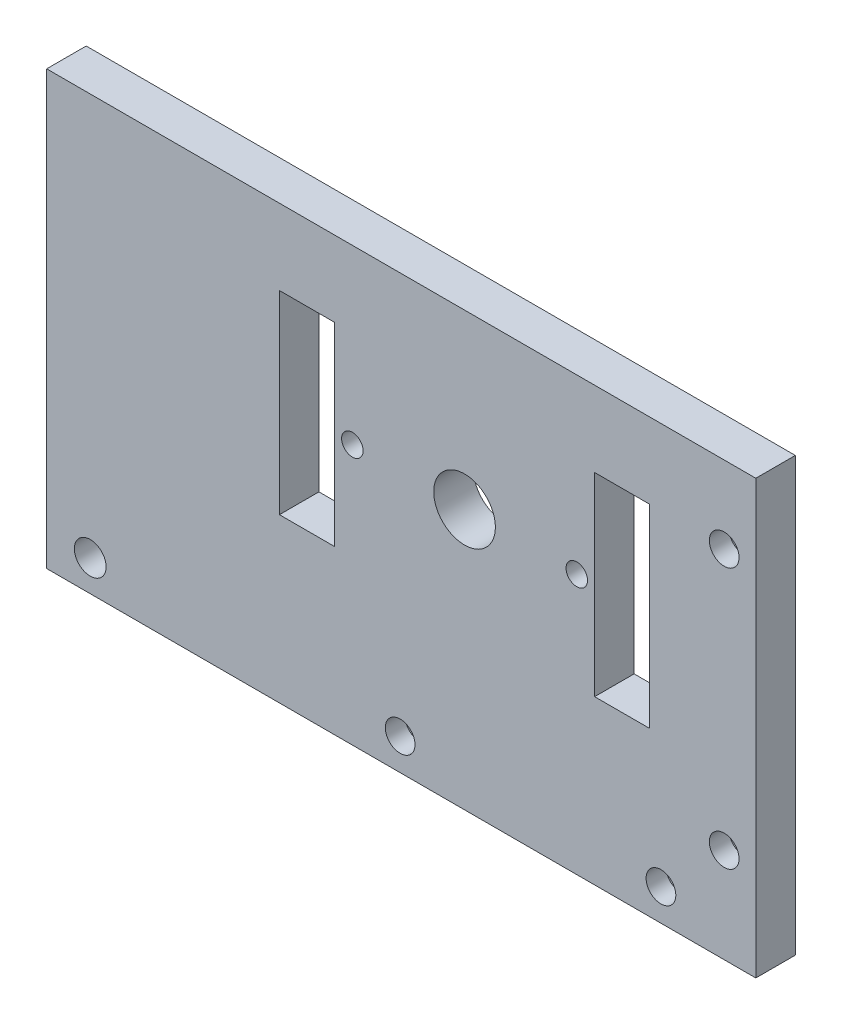
ISO-10303-21;
HEADER;
FILE_DESCRIPTION(('STEP AP214'),'2;1');
FILE_NAME('part.step','',(''),(''),'','','');
FILE_SCHEMA(('AUTOMOTIVE_DESIGN { 1 0 10303 214 1 1 1 1 }'));
ENDSEC;
DATA;
#1=APPLICATION_CONTEXT('core data for automotive mechanical design processes');
#2=APPLICATION_PROTOCOL_DEFINITION('international standard','automotive_design',2000,#1);
#3=PRODUCT_CONTEXT('',#1,'mechanical');
#4=PRODUCT('Part','Part','',(#3));
#5=PRODUCT_RELATED_PRODUCT_CATEGORY('part','',(#4));
#6=PRODUCT_DEFINITION_FORMATION('','',#4);
#7=PRODUCT_DEFINITION_CONTEXT('part definition',#1,'design');
#8=PRODUCT_DEFINITION('design','',#6,#7);
#9=PRODUCT_DEFINITION_SHAPE('','',#8);
#10=(LENGTH_UNIT() NAMED_UNIT(*) SI_UNIT(.MILLI.,.METRE.));
#11=(NAMED_UNIT(*) PLANE_ANGLE_UNIT() SI_UNIT($,.RADIAN.));
#12=(NAMED_UNIT(*) SI_UNIT($,.STERADIAN.) SOLID_ANGLE_UNIT());
#13=UNCERTAINTY_MEASURE_WITH_UNIT(LENGTH_MEASURE(1.E-05),#10,'distance_accuracy_value','');
#14=(GEOMETRIC_REPRESENTATION_CONTEXT(3) GLOBAL_UNCERTAINTY_ASSIGNED_CONTEXT((#13)) GLOBAL_UNIT_ASSIGNED_CONTEXT((#10,
#11,#12)) REPRESENTATION_CONTEXT('',''));
#15=CARTESIAN_POINT('',(0.,0.,0.));
#16=DIRECTION('',(0.,0.,1.));
#17=DIRECTION('',(1.,0.,0.));
#18=AXIS2_PLACEMENT_3D('',#15,#16,#17);
#19=CARTESIAN_POINT('',(-7.87400000000002,59.944,6.35));
#20=DIRECTION('',(0.,0.,-1.));
#21=DIRECTION('',(-1.,0.,0.));
#22=AXIS2_PLACEMENT_3D('',#19,#20,#21);
#23=CYLINDRICAL_SURFACE('',#22,1.5875);
#24=CARTESIAN_POINT('',(-7.87400000000002,59.944,0.));
#25=DIRECTION('',(0.,0.,1.));
#26=DIRECTION('',(1.,0.,0.));
#27=AXIS2_PLACEMENT_3D('',#24,#25,#26);
#28=CIRCLE('',#27,1.5875);
#29=CARTESIAN_POINT('',(-6.28650000000002,59.944,0.));
#30=VERTEX_POINT('',#29);
#31=EDGE_CURVE('E242',#30,#30,#28,.T.);
#32=ORIENTED_EDGE('',*,*,#31,.F.);
#33=EDGE_LOOP('',(#32));
#34=FACE_BOUND('',#33,.T.);
#35=CARTESIAN_POINT('',(-7.87400000000002,59.944,3.175));
#36=DIRECTION('',(0.,0.,1.));
#37=DIRECTION('',(1.,0.,0.));
#38=AXIS2_PLACEMENT_3D('',#35,#36,#37);
#39=CIRCLE('',#38,1.5875);
#40=CARTESIAN_POINT('',(-6.28650000000002,59.944,3.175));
#41=VERTEX_POINT('',#40);
#42=EDGE_CURVE('E307',#41,#41,#39,.T.);
#43=ORIENTED_EDGE('',*,*,#42,.T.);
#44=EDGE_LOOP('',(#43));
#45=FACE_BOUND('',#44,.T.);
#46=ADVANCED_FACE('F73',(#34,#45),#23,.F.);
#47=CARTESIAN_POINT('',(-18.034,7.87400000000001,6.35));
#48=DIRECTION('',(0.,0.,-1.));
#49=DIRECTION('',(-1.,0.,0.));
#50=AXIS2_PLACEMENT_3D('',#47,#48,#49);
#51=CYLINDRICAL_SURFACE('',#50,1.5875);
#52=CARTESIAN_POINT('',(-18.034,7.87400000000001,0.));
#53=DIRECTION('',(0.,0.,1.));
#54=DIRECTION('',(1.,0.,0.));
#55=AXIS2_PLACEMENT_3D('',#52,#53,#54);
#56=CIRCLE('',#55,1.5875);
#57=CARTESIAN_POINT('',(-16.4465,7.87400000000001,0.));
#58=VERTEX_POINT('',#57);
#59=EDGE_CURVE('E238',#58,#58,#56,.T.);
#60=ORIENTED_EDGE('',*,*,#59,.F.);
#61=EDGE_LOOP('',(#60));
#62=FACE_BOUND('',#61,.T.);
#63=CARTESIAN_POINT('',(-18.034,7.87400000000001,3.175));
#64=DIRECTION('',(0.,0.,1.));
#65=DIRECTION('',(1.,0.,0.));
#66=AXIS2_PLACEMENT_3D('',#63,#64,#65);
#67=CIRCLE('',#66,1.5875);
#68=CARTESIAN_POINT('',(-16.4465,7.87400000000001,3.175));
#69=VERTEX_POINT('',#68);
#70=EDGE_CURVE('E318',#69,#69,#67,.T.);
#71=ORIENTED_EDGE('',*,*,#70,.T.);
#72=EDGE_LOOP('',(#71));
#73=FACE_BOUND('',#72,.T.);
#74=ADVANCED_FACE('F423',(#62,#73),#51,.F.);
#75=CARTESIAN_POINT('',(-59.944,7.87400000000001,6.35));
#76=DIRECTION('',(0.,0.,-1.));
#77=DIRECTION('',(-1.,0.,0.));
#78=AXIS2_PLACEMENT_3D('',#75,#76,#77);
#79=CYLINDRICAL_SURFACE('',#78,1.5875);
#80=CARTESIAN_POINT('',(-59.944,7.87400000000001,0.));
#81=DIRECTION('',(0.,0.,1.));
#82=DIRECTION('',(1.,0.,0.));
#83=AXIS2_PLACEMENT_3D('',#80,#81,#82);
#84=CIRCLE('',#83,1.5875);
#85=CARTESIAN_POINT('',(-58.3565,7.87400000000001,0.));
#86=VERTEX_POINT('',#85);
#87=EDGE_CURVE('E234',#86,#86,#84,.T.);
#88=ORIENTED_EDGE('',*,*,#87,.F.);
#89=EDGE_LOOP('',(#88));
#90=FACE_BOUND('',#89,.T.);
#91=CARTESIAN_POINT('',(-59.944,7.87400000000001,3.175));
#92=DIRECTION('',(0.,0.,1.));
#93=DIRECTION('',(1.,0.,0.));
#94=AXIS2_PLACEMENT_3D('',#91,#92,#93);
#95=CIRCLE('',#94,1.5875);
#96=CARTESIAN_POINT('',(-58.3565,7.87400000000001,3.175));
#97=VERTEX_POINT('',#96);
#98=EDGE_CURVE('E322',#97,#97,#95,.T.);
#99=ORIENTED_EDGE('',*,*,#98,.T.);
#100=EDGE_LOOP('',(#99));
#101=FACE_BOUND('',#100,.T.);
#102=ADVANCED_FACE('F429',(#90,#101),#79,.F.);
#103=CARTESIAN_POINT('',(-7.87399999999999,18.034,6.35));
#104=DIRECTION('',(0.,0.,-1.));
#105=DIRECTION('',(-1.,0.,0.));
#106=AXIS2_PLACEMENT_3D('',#103,#104,#105);
#107=CYLINDRICAL_SURFACE('',#106,1.5875);
#108=CARTESIAN_POINT('',(-7.87399999999999,18.034,0.));
#109=DIRECTION('',(0.,0.,1.));
#110=DIRECTION('',(1.,0.,0.));
#111=AXIS2_PLACEMENT_3D('',#108,#109,#110);
#112=CIRCLE('',#111,1.5875);
#113=CARTESIAN_POINT('',(-6.28649999999999,18.034,0.));
#114=VERTEX_POINT('',#113);
#115=EDGE_CURVE('E246',#114,#114,#112,.T.);
#116=ORIENTED_EDGE('',*,*,#115,.F.);
#117=EDGE_LOOP('',(#116));
#118=FACE_BOUND('',#117,.T.);
#119=CARTESIAN_POINT('',(-7.87399999999999,18.034,3.175));
#120=DIRECTION('',(0.,0.,1.));
#121=DIRECTION('',(1.,0.,0.));
#122=AXIS2_PLACEMENT_3D('',#119,#120,#121);
#123=CIRCLE('',#122,1.5875);
#124=CARTESIAN_POINT('',(-6.28649999999999,18.034,3.175));
#125=VERTEX_POINT('',#124);
#126=EDGE_CURVE('E308',#125,#125,#123,.T.);
#127=ORIENTED_EDGE('',*,*,#126,.T.);
#128=EDGE_LOOP('',(#127));
#129=FACE_BOUND('',#128,.T.);
#130=ADVANCED_FACE('F435',(#118,#129),#107,.F.);
#131=CARTESIAN_POINT('',(0.,60.1939999998697,6.35));
#132=DIRECTION('',(0.,1.,0.));
#133=DIRECTION('',(-1.,0.,0.));
#134=AXIS2_PLACEMENT_3D('',#131,#132,#133);
#135=PLANE('',#134);
#136=DIRECTION('',(1.,0.,0.));
#137=VECTOR('',#136,1.);
#138=CARTESIAN_POINT('',(0.,60.1939999998697,0.));
#139=LINE('',#138,#137);
#140=CARTESIAN_POINT('',(-28.6940000001301,60.1939999998697,0.));
#141=VERTEX_POINT('',#140);
#142=CARTESIAN_POINT('',(-19.8440000001301,60.1939999998697,0.));
#143=VERTEX_POINT('',#142);
#144=EDGE_CURVE('E222',#141,#143,#139,.T.);
#145=ORIENTED_EDGE('',*,*,#144,.T.);
#146=DIRECTION('',(0.,0.,-1.));
#147=VECTOR('',#146,1.);
#148=CARTESIAN_POINT('',(-19.8440000001301,60.1939999998697,6.35));
#149=LINE('',#148,#147);
#150=CARTESIAN_POINT('',(-19.8440000001301,60.1939999998697,6.35));
#151=VERTEX_POINT('',#150);
#152=EDGE_CURVE('E12',#151,#143,#149,.T.);
#153=ORIENTED_EDGE('',*,*,#152,.F.);
#154=DIRECTION('',(1.,0.,0.));
#155=VECTOR('',#154,1.);
#156=CARTESIAN_POINT('',(0.,60.1939999998697,6.35));
#157=LINE('',#156,#155);
#158=CARTESIAN_POINT('',(-28.6940000001301,60.1939999998697,6.35));
#159=VERTEX_POINT('',#158);
#160=EDGE_CURVE('E168',#159,#151,#157,.T.);
#161=ORIENTED_EDGE('',*,*,#160,.F.);
#162=DIRECTION('',(0.,0.,-1.));
#163=VECTOR('',#162,1.);
#164=CARTESIAN_POINT('',(-28.6940000001301,60.1939999998697,6.35));
#165=LINE('',#164,#163);
#166=EDGE_CURVE('E93',#159,#141,#165,.T.);
#167=ORIENTED_EDGE('',*,*,#166,.T.);
#168=EDGE_LOOP('',(#145,#153,#161,#167));
#169=FACE_BOUND('',#168,.T.);
#170=ADVANCED_FACE('F448',(#169),#135,.F.);
#171=CARTESIAN_POINT('',(-19.8440000001301,0.,6.35));
#172=DIRECTION('',(1.,0.,0.));
#173=DIRECTION('',(0.,0.,-1.));
#174=AXIS2_PLACEMENT_3D('',#171,#172,#173);
#175=PLANE('',#174);
#176=DIRECTION('',(0.,-1.,0.));
#177=VECTOR('',#176,1.);
#178=CARTESIAN_POINT('',(-19.8440000001301,0.,0.));
#179=LINE('',#178,#177);
#180=CARTESIAN_POINT('',(-19.8440000001301,28.9939999998697,0.));
#181=VERTEX_POINT('',#180);
#182=EDGE_CURVE('E175',#143,#181,#179,.T.);
#183=ORIENTED_EDGE('',*,*,#182,.T.);
#184=DIRECTION('',(0.,0.,-1.));
#185=VECTOR('',#184,1.);
#186=CARTESIAN_POINT('',(-19.8440000001301,28.9939999998697,6.35));
#187=LINE('',#186,#185);
#188=CARTESIAN_POINT('',(-19.8440000001301,28.9939999998697,6.35));
#189=VERTEX_POINT('',#188);
#190=EDGE_CURVE('E84',#189,#181,#187,.T.);
#191=ORIENTED_EDGE('',*,*,#190,.F.);
#192=DIRECTION('',(0.,-1.,0.));
#193=VECTOR('',#192,1.);
#194=CARTESIAN_POINT('',(-19.8440000001301,0.,6.35));
#195=LINE('',#194,#193);
#196=EDGE_CURVE('E162',#151,#189,#195,.T.);
#197=ORIENTED_EDGE('',*,*,#196,.F.);
#198=ORIENTED_EDGE('',*,*,#152,.T.);
#199=EDGE_LOOP('',(#183,#191,#197,#198));
#200=FACE_BOUND('',#199,.T.);
#201=ADVANCED_FACE('F174',(#200),#175,.F.);
#202=CARTESIAN_POINT('',(0.,28.9939999998698,6.35));
#203=DIRECTION('',(0.,1.,0.));
#204=DIRECTION('',(-1.,0.,0.));
#205=AXIS2_PLACEMENT_3D('',#202,#203,#204);
#206=PLANE('',#205);
#207=DIRECTION('',(1.,0.,0.));
#208=VECTOR('',#207,1.);
#209=CARTESIAN_POINT('',(0.,28.9939999998698,0.));
#210=LINE('',#209,#208);
#211=CARTESIAN_POINT('',(-28.6940000001301,28.9939999998697,0.));
#212=VERTEX_POINT('',#211);
#213=EDGE_CURVE('E227',#212,#181,#210,.T.);
#214=ORIENTED_EDGE('',*,*,#213,.F.);
#215=DIRECTION('',(0.,0.,-1.));
#216=VECTOR('',#215,1.);
#217=CARTESIAN_POINT('',(-28.6940000001301,28.9939999998697,6.35));
#218=LINE('',#217,#216);
#219=CARTESIAN_POINT('',(-28.6940000001301,28.9939999998697,6.35));
#220=VERTEX_POINT('',#219);
#221=EDGE_CURVE('E126',#220,#212,#218,.T.);
#222=ORIENTED_EDGE('',*,*,#221,.F.);
#223=DIRECTION('',(1.,0.,0.));
#224=VECTOR('',#223,1.);
#225=CARTESIAN_POINT('',(0.,28.9939999998698,6.35));
#226=LINE('',#225,#224);
#227=EDGE_CURVE('E167',#220,#189,#226,.T.);
#228=ORIENTED_EDGE('',*,*,#227,.T.);
#229=ORIENTED_EDGE('',*,*,#190,.T.);
#230=EDGE_LOOP('',(#214,#222,#228,#229));
#231=FACE_BOUND('',#230,.T.);
#232=ADVANCED_FACE('F180',(#231),#206,.T.);
#233=CARTESIAN_POINT('',(0.,60.1939999998698,6.35));
#234=DIRECTION('',(0.,1.,0.));
#235=DIRECTION('',(-1.,0.,0.));
#236=AXIS2_PLACEMENT_3D('',#233,#234,#235);
#237=PLANE('',#236);
#238=DIRECTION('',(1.,0.,0.));
#239=VECTOR('',#238,1.);
#240=CARTESIAN_POINT('',(0.,60.1939999998698,0.));
#241=LINE('',#240,#239);
#242=CARTESIAN_POINT('',(-79.3440000001301,60.1939999998697,0.));
#243=VERTEX_POINT('',#242);
#244=CARTESIAN_POINT('',(-70.4940000001301,60.1939999998697,0.));
#245=VERTEX_POINT('',#244);
#246=EDGE_CURVE('E206',#243,#245,#241,.T.);
#247=ORIENTED_EDGE('',*,*,#246,.T.);
#248=DIRECTION('',(0.,0.,-1.));
#249=VECTOR('',#248,1.);
#250=CARTESIAN_POINT('',(-70.4940000001301,60.1939999998697,6.35));
#251=LINE('',#250,#249);
#252=CARTESIAN_POINT('',(-70.4940000001301,60.1939999998697,6.35));
#253=VERTEX_POINT('',#252);
#254=EDGE_CURVE('E253',#253,#245,#251,.T.);
#255=ORIENTED_EDGE('',*,*,#254,.F.);
#256=DIRECTION('',(1.,0.,0.));
#257=VECTOR('',#256,1.);
#258=CARTESIAN_POINT('',(0.,60.1939999998698,6.35));
#259=LINE('',#258,#257);
#260=CARTESIAN_POINT('',(-79.3440000001301,60.1939999998697,6.35));
#261=VERTEX_POINT('',#260);
#262=EDGE_CURVE('E381',#261,#253,#259,.T.);
#263=ORIENTED_EDGE('',*,*,#262,.F.);
#264=DIRECTION('',(0.,0.,-1.));
#265=VECTOR('',#264,1.);
#266=CARTESIAN_POINT('',(-79.3440000001301,60.1939999998697,6.35));
#267=LINE('',#266,#265);
#268=EDGE_CURVE('E256',#261,#243,#267,.T.);
#269=ORIENTED_EDGE('',*,*,#268,.T.);
#270=EDGE_LOOP('',(#247,#255,#263,#269));
#271=FACE_BOUND('',#270,.T.);
#272=ADVANCED_FACE('F411',(#271),#237,.F.);
#273=CARTESIAN_POINT('',(-70.4940000001301,0.,6.35));
#274=DIRECTION('',(1.,0.,0.));
#275=DIRECTION('',(0.,0.,-1.));
#276=AXIS2_PLACEMENT_3D('',#273,#274,#275);
#277=PLANE('',#276);
#278=DIRECTION('',(0.,-1.,0.));
#279=VECTOR('',#278,1.);
#280=CARTESIAN_POINT('',(-70.4940000001301,0.,0.));
#281=LINE('',#280,#279);
#282=CARTESIAN_POINT('',(-70.4940000001301,28.9939999998697,0.));
#283=VERTEX_POINT('',#282);
#284=EDGE_CURVE('E210',#245,#283,#281,.T.);
#285=ORIENTED_EDGE('',*,*,#284,.T.);
#286=DIRECTION('',(0.,0.,-1.));
#287=VECTOR('',#286,1.);
#288=CARTESIAN_POINT('',(-70.4940000001301,28.9939999998697,6.35));
#289=LINE('',#288,#287);
#290=CARTESIAN_POINT('',(-70.4940000001301,28.9939999998697,6.35));
#291=VERTEX_POINT('',#290);
#292=EDGE_CURVE('E262',#291,#283,#289,.T.);
#293=ORIENTED_EDGE('',*,*,#292,.F.);
#294=DIRECTION('',(0.,-1.,0.));
#295=VECTOR('',#294,1.);
#296=CARTESIAN_POINT('',(-70.4940000001301,0.,6.35));
#297=LINE('',#296,#295);
#298=EDGE_CURVE('E385',#253,#291,#297,.T.);
#299=ORIENTED_EDGE('',*,*,#298,.F.);
#300=ORIENTED_EDGE('',*,*,#254,.T.);
#301=EDGE_LOOP('',(#285,#293,#299,#300));
#302=FACE_BOUND('',#301,.T.);
#303=ADVANCED_FACE('F413',(#302),#277,.F.);
#304=CARTESIAN_POINT('',(0.,28.9939999998697,6.35));
#305=DIRECTION('',(0.,1.,0.));
#306=DIRECTION('',(-1.,0.,0.));
#307=AXIS2_PLACEMENT_3D('',#304,#305,#306);
#308=PLANE('',#307);
#309=DIRECTION('',(1.,0.,0.));
#310=VECTOR('',#309,1.);
#311=CARTESIAN_POINT('',(0.,28.9939999998697,0.));
#312=LINE('',#311,#310);
#313=CARTESIAN_POINT('',(-79.3440000001301,28.9939999998697,0.));
#314=VERTEX_POINT('',#313);
#315=EDGE_CURVE('E214',#314,#283,#312,.T.);
#316=ORIENTED_EDGE('',*,*,#315,.F.);
#317=DIRECTION('',(0.,0.,-1.));
#318=VECTOR('',#317,1.);
#319=CARTESIAN_POINT('',(-79.3440000001301,28.9939999998697,6.35));
#320=LINE('',#319,#318);
#321=CARTESIAN_POINT('',(-79.3440000001301,28.9939999998697,6.35));
#322=VERTEX_POINT('',#321);
#323=EDGE_CURVE('E259',#322,#314,#320,.T.);
#324=ORIENTED_EDGE('',*,*,#323,.F.);
#325=DIRECTION('',(1.,0.,0.));
#326=VECTOR('',#325,1.);
#327=CARTESIAN_POINT('',(0.,28.9939999998697,6.35));
#328=LINE('',#327,#326);
#329=EDGE_CURVE('E388',#322,#291,#328,.T.);
#330=ORIENTED_EDGE('',*,*,#329,.T.);
#331=ORIENTED_EDGE('',*,*,#292,.T.);
#332=EDGE_LOOP('',(#316,#324,#330,#331));
#333=FACE_BOUND('',#332,.T.);
#334=ADVANCED_FACE('F407',(#333),#308,.T.);
#335=CARTESIAN_POINT('',(-2.79400000013013,0.,6.35));
#336=DIRECTION('',(1.,0.,0.));
#337=DIRECTION('',(0.,1.,0.));
#338=AXIS2_PLACEMENT_3D('',#335,#336,#337);
#339=PLANE('',#338);
#340=DIRECTION('',(0.,-1.,0.));
#341=VECTOR('',#340,1.);
#342=CARTESIAN_POINT('',(-2.79400000013013,0.,0.));
#343=LINE('',#342,#341);
#344=CARTESIAN_POINT('',(-2.7940000001301,72.3439999998698,0.));
#345=VERTEX_POINT('',#344);
#346=CARTESIAN_POINT('',(-2.79400000013013,2.79399999986978,0.));
#347=VERTEX_POINT('',#346);
#348=EDGE_CURVE('E193',#345,#347,#343,.T.);
#349=ORIENTED_EDGE('',*,*,#348,.F.);
#350=DIRECTION('',(0.,0.,-1.));
#351=VECTOR('',#350,1.);
#352=CARTESIAN_POINT('',(-2.7940000001301,72.3439999998698,6.35));
#353=LINE('',#352,#351);
#354=CARTESIAN_POINT('',(-2.7940000001301,72.3439999998698,6.35));
#355=VERTEX_POINT('',#354);
#356=EDGE_CURVE('E77',#355,#345,#353,.T.);
#357=ORIENTED_EDGE('',*,*,#356,.F.);
#358=DIRECTION('',(0.,-1.,0.));
#359=VECTOR('',#358,1.);
#360=CARTESIAN_POINT('',(-2.79400000013013,0.,6.35));
#361=LINE('',#360,#359);
#362=CARTESIAN_POINT('',(-2.79400000013013,2.79399999986978,6.35));
#363=VERTEX_POINT('',#362);
#364=EDGE_CURVE('E373',#355,#363,#361,.T.);
#365=ORIENTED_EDGE('',*,*,#364,.T.);
#366=DIRECTION('',(0.,0.,-1.));
#367=VECTOR('',#366,1.);
#368=CARTESIAN_POINT('',(-2.79400000013013,2.79399999986978,6.35));
#369=LINE('',#368,#367);
#370=EDGE_CURVE('E185',#363,#347,#369,.T.);
#371=ORIENTED_EDGE('',*,*,#370,.T.);
#372=EDGE_LOOP('',(#349,#357,#365,#371));
#373=FACE_BOUND('',#372,.T.);
#374=ADVANCED_FACE('F279',(#373),#339,.T.);
#375=CARTESIAN_POINT('',(0.,72.3439999998698,6.35));
#376=DIRECTION('',(0.,1.,0.));
#377=DIRECTION('',(0.,0.,1.));
#378=AXIS2_PLACEMENT_3D('',#375,#376,#377);
#379=PLANE('',#378);
#380=DIRECTION('',(1.,0.,0.));
#381=VECTOR('',#380,1.);
#382=CARTESIAN_POINT('',(0.,72.3439999998698,0.));
#383=LINE('',#382,#381);
#384=CARTESIAN_POINT('',(-116.74400000013,72.3439999998698,0.));
#385=VERTEX_POINT('',#384);
#386=EDGE_CURVE('E198',#385,#345,#383,.T.);
#387=ORIENTED_EDGE('',*,*,#386,.F.);
#388=DIRECTION('',(0.,0.,-1.));
#389=VECTOR('',#388,1.);
#390=CARTESIAN_POINT('',(-116.74400000013,72.3439999998698,80.3929773847595));
#391=LINE('',#390,#389);
#392=CARTESIAN_POINT('',(-116.74400000013,72.3439999998698,6.34999999999999));
#393=VERTEX_POINT('',#392);
#394=EDGE_CURVE('E298',#393,#385,#391,.T.);
#395=ORIENTED_EDGE('',*,*,#394,.F.);
#396=DIRECTION('',(1.,0.,0.));
#397=VECTOR('',#396,1.);
#398=CARTESIAN_POINT('',(0.,72.3439999998698,6.35));
#399=LINE('',#398,#397);
#400=EDGE_CURVE('E278',#393,#355,#399,.T.);
#401=ORIENTED_EDGE('',*,*,#400,.T.);
#402=ORIENTED_EDGE('',*,*,#356,.T.);
#403=EDGE_LOOP('',(#387,#395,#401,#402));
#404=FACE_BOUND('',#403,.T.);
#405=ADVANCED_FACE('F273',(#404),#379,.T.);
#406=CARTESIAN_POINT('',(-28.6940000001301,0.,6.35));
#407=DIRECTION('',(1.,0.,0.));
#408=DIRECTION('',(0.,0.,-1.));
#409=AXIS2_PLACEMENT_3D('',#406,#407,#408);
#410=PLANE('',#409);
#411=DIRECTION('',(0.,-1.,0.));
#412=VECTOR('',#411,1.);
#413=CARTESIAN_POINT('',(-28.6940000001301,0.,0.));
#414=LINE('',#413,#412);
#415=EDGE_CURVE('E230',#141,#212,#414,.T.);
#416=ORIENTED_EDGE('',*,*,#415,.F.);
#417=ORIENTED_EDGE('',*,*,#166,.F.);
#418=DIRECTION('',(0.,-1.,0.));
#419=VECTOR('',#418,1.);
#420=CARTESIAN_POINT('',(-28.6940000001301,0.,6.35));
#421=LINE('',#420,#419);
#422=EDGE_CURVE('E182',#159,#220,#421,.T.);
#423=ORIENTED_EDGE('',*,*,#422,.T.);
#424=ORIENTED_EDGE('',*,*,#221,.T.);
#425=EDGE_LOOP('',(#416,#417,#423,#424));
#426=FACE_BOUND('',#425,.T.);
#427=ADVANCED_FACE('F441',(#426),#410,.T.);
#428=CARTESIAN_POINT('',(-79.3440000001301,0.,6.35));
#429=DIRECTION('',(1.,0.,0.));
#430=DIRECTION('',(0.,0.,-1.));
#431=AXIS2_PLACEMENT_3D('',#428,#429,#430);
#432=PLANE('',#431);
#433=DIRECTION('',(0.,-1.,0.));
#434=VECTOR('',#433,1.);
#435=CARTESIAN_POINT('',(-79.3440000001301,0.,0.));
#436=LINE('',#435,#434);
#437=EDGE_CURVE('E218',#243,#314,#436,.T.);
#438=ORIENTED_EDGE('',*,*,#437,.F.);
#439=ORIENTED_EDGE('',*,*,#268,.F.);
#440=DIRECTION('',(0.,-1.,0.));
#441=VECTOR('',#440,1.);
#442=CARTESIAN_POINT('',(-79.3440000001301,0.,6.35));
#443=LINE('',#442,#441);
#444=EDGE_CURVE('E392',#261,#322,#443,.T.);
#445=ORIENTED_EDGE('',*,*,#444,.T.);
#446=ORIENTED_EDGE('',*,*,#323,.T.);
#447=EDGE_LOOP('',(#438,#439,#445,#446));
#448=FACE_BOUND('',#447,.T.);
#449=ADVANCED_FACE('F399',(#448),#432,.T.);
#450=CARTESIAN_POINT('',(0.,2.79399999986978,6.35));
#451=DIRECTION('',(0.,1.,0.));
#452=DIRECTION('',(-1.,0.,0.));
#453=AXIS2_PLACEMENT_3D('',#450,#451,#452);
#454=PLANE('',#453);
#455=DIRECTION('',(1.,0.,0.));
#456=VECTOR('',#455,1.);
#457=CARTESIAN_POINT('',(0.,2.79399999986978,0.));
#458=LINE('',#457,#456);
#459=CARTESIAN_POINT('',(-116.74400000013,2.79399999986973,0.));
#460=VERTEX_POINT('',#459);
#461=EDGE_CURVE('E202',#460,#347,#458,.T.);
#462=ORIENTED_EDGE('',*,*,#461,.T.);
#463=ORIENTED_EDGE('',*,*,#370,.F.);
#464=DIRECTION('',(1.,0.,0.));
#465=VECTOR('',#464,1.);
#466=CARTESIAN_POINT('',(0.,2.79399999986978,6.35));
#467=LINE('',#466,#465);
#468=CARTESIAN_POINT('',(-116.74400000013,2.79399999986973,6.34999999999999));
#469=VERTEX_POINT('',#468);
#470=EDGE_CURVE('E378',#469,#363,#467,.T.);
#471=ORIENTED_EDGE('',*,*,#470,.F.);
#472=DIRECTION('',(0.,0.,-1.));
#473=VECTOR('',#472,1.);
#474=CARTESIAN_POINT('',(-116.74400000013,2.79399999986973,80.3929773847595));
#475=LINE('',#474,#473);
#476=EDGE_CURVE('E293',#469,#460,#475,.T.);
#477=ORIENTED_EDGE('',*,*,#476,.T.);
#478=EDGE_LOOP('',(#462,#463,#471,#477));
#479=FACE_BOUND('',#478,.T.);
#480=ADVANCED_FACE('F452',(#479),#454,.F.);
#481=CARTESIAN_POINT('',(-49.5940000001301,44.5939999998697,6.35));
#482=DIRECTION('',(0.,0.,-1.));
#483=DIRECTION('',(-1.,0.,0.));
#484=AXIS2_PLACEMENT_3D('',#481,#482,#483);
#485=CYLINDRICAL_SURFACE('',#484,4.95299999999998);
#486=CARTESIAN_POINT('',(-49.5940000001301,44.5939999998697,6.35));
#487=DIRECTION('',(0.,0.,1.));
#488=DIRECTION('',(1.,0.,0.));
#489=AXIS2_PLACEMENT_3D('',#486,#487,#488);
#490=CIRCLE('',#489,4.95299999999998);
#491=CARTESIAN_POINT('',(-44.6410000001301,44.5939999998697,6.35));
#492=VERTEX_POINT('',#491);
#493=EDGE_CURVE('E250',#492,#492,#490,.T.);
#494=ORIENTED_EDGE('',*,*,#493,.T.);
#495=EDGE_LOOP('',(#494));
#496=FACE_BOUND('',#495,.T.);
#497=CARTESIAN_POINT('',(-49.5940000001301,44.5939999998697,0.));
#498=DIRECTION('',(0.,0.,1.));
#499=DIRECTION('',(1.,0.,0.));
#500=AXIS2_PLACEMENT_3D('',#497,#498,#499);
#501=CIRCLE('',#500,4.95299999999998);
#502=CARTESIAN_POINT('',(-44.6410000001301,44.5939999998697,0.));
#503=VERTEX_POINT('',#502);
#504=EDGE_CURVE('E189',#503,#503,#501,.T.);
#505=ORIENTED_EDGE('',*,*,#504,.F.);
#506=EDGE_LOOP('',(#505));
#507=FACE_BOUND('',#506,.T.);
#508=ADVANCED_FACE('F75',(#496,#507),#485,.F.);
#509=CARTESIAN_POINT('',(0.,0.,6.35));
#510=DIRECTION('',(0.,0.,1.));
#511=DIRECTION('',(1.,0.,0.));
#512=AXIS2_PLACEMENT_3D('',#509,#510,#511);
#513=PLANE('',#512);
#514=CARTESIAN_POINT('',(-109.74400000013,7.79399999986973,6.35));
#515=DIRECTION('',(0.,0.,1.));
#516=DIRECTION('',(1.,0.,0.));
#517=AXIS2_PLACEMENT_3D('',#514,#515,#516);
#518=CIRCLE('',#517,2.55269999999999);
#519=CARTESIAN_POINT('',(-107.19130000013,7.79399999986973,6.35));
#520=VERTEX_POINT('',#519);
#521=EDGE_CURVE('E833',#520,#520,#518,.T.);
#522=ORIENTED_EDGE('',*,*,#521,.F.);
#523=EDGE_LOOP('',(#522));
#524=FACE_BOUND('',#523,.T.);
#525=CARTESIAN_POINT('',(-7.87400000000002,59.944,6.35));
#526=DIRECTION('',(0.,0.,1.));
#527=DIRECTION('',(1.,0.,0.));
#528=AXIS2_PLACEMENT_3D('',#525,#526,#527);
#529=CIRCLE('',#528,2.3876);
#530=CARTESIAN_POINT('',(-5.48640000000002,59.944,6.35));
#531=VERTEX_POINT('',#530);
#532=EDGE_CURVE('E337',#531,#531,#529,.T.);
#533=ORIENTED_EDGE('',*,*,#532,.F.);
#534=EDGE_LOOP('',(#533));
#535=FACE_BOUND('',#534,.T.);
#536=CARTESIAN_POINT('',(-59.944,7.87400000000001,6.35));
#537=DIRECTION('',(0.,0.,1.));
#538=DIRECTION('',(1.,0.,0.));
#539=AXIS2_PLACEMENT_3D('',#536,#537,#538);
#540=CIRCLE('',#539,2.3876);
#541=CARTESIAN_POINT('',(-57.5564,7.87400000000001,6.35));
#542=VERTEX_POINT('',#541);
#543=EDGE_CURVE('E326',#542,#542,#540,.T.);
#544=ORIENTED_EDGE('',*,*,#543,.F.);
#545=EDGE_LOOP('',(#544));
#546=FACE_BOUND('',#545,.T.);
#547=CARTESIAN_POINT('',(-7.87399999999999,18.034,6.35));
#548=DIRECTION('',(0.,0.,1.));
#549=DIRECTION('',(1.,0.,0.));
#550=AXIS2_PLACEMENT_3D('',#547,#548,#549);
#551=CIRCLE('',#550,2.3876);
#552=CARTESIAN_POINT('',(-5.48639999999999,18.034,6.35));
#553=VERTEX_POINT('',#552);
#554=EDGE_CURVE('E312',#553,#553,#551,.T.);
#555=ORIENTED_EDGE('',*,*,#554,.F.);
#556=EDGE_LOOP('',(#555));
#557=FACE_BOUND('',#556,.T.);
#558=CARTESIAN_POINT('',(-18.034,7.87400000000001,6.35));
#559=DIRECTION('',(0.,0.,1.));
#560=DIRECTION('',(1.,0.,0.));
#561=AXIS2_PLACEMENT_3D('',#558,#559,#560);
#562=CIRCLE('',#561,2.3876);
#563=CARTESIAN_POINT('',(-15.6464,7.87400000000001,6.35));
#564=VERTEX_POINT('',#563);
#565=EDGE_CURVE('E347',#564,#564,#562,.T.);
#566=ORIENTED_EDGE('',*,*,#565,.F.);
#567=EDGE_LOOP('',(#566));
#568=FACE_BOUND('',#567,.T.);
#569=CARTESIAN_POINT('',(-67.6280000001301,44.5939999998697,6.35));
#570=DIRECTION('',(0.,0.,1.));
#571=DIRECTION('',(1.,0.,0.));
#572=AXIS2_PLACEMENT_3D('',#569,#570,#571);
#573=CIRCLE('',#572,1.7272);
#574=CARTESIAN_POINT('',(-65.9008000001301,44.5939999998697,6.35));
#575=VERTEX_POINT('',#574);
#576=EDGE_CURVE('E352',#575,#575,#573,.T.);
#577=ORIENTED_EDGE('',*,*,#576,.F.);
#578=EDGE_LOOP('',(#577));
#579=FACE_BOUND('',#578,.T.);
#580=CARTESIAN_POINT('',(-31.5600000001301,44.5939999998697,6.35));
#581=DIRECTION('',(0.,0.,1.));
#582=DIRECTION('',(1.,0.,0.));
#583=AXIS2_PLACEMENT_3D('',#580,#581,#582);
#584=CIRCLE('',#583,1.7272);
#585=CARTESIAN_POINT('',(-29.8328000001301,44.5939999998697,6.35));
#586=VERTEX_POINT('',#585);
#587=EDGE_CURVE('E363',#586,#586,#584,.T.);
#588=ORIENTED_EDGE('',*,*,#587,.F.);
#589=EDGE_LOOP('',(#588));
#590=FACE_BOUND('',#589,.T.);
#591=ORIENTED_EDGE('',*,*,#493,.F.);
#592=EDGE_LOOP('',(#591));
#593=FACE_BOUND('',#592,.T.);
#594=ORIENTED_EDGE('',*,*,#364,.F.);
#595=ORIENTED_EDGE('',*,*,#400,.F.);
#596=DIRECTION('',(0.,-1.,0.));
#597=VECTOR('',#596,1.);
#598=CARTESIAN_POINT('',(-116.74400000013,2.79399999986973,6.34999999999999));
#599=LINE('',#598,#597);
#600=EDGE_CURVE('E294',#393,#469,#599,.T.);
#601=ORIENTED_EDGE('',*,*,#600,.T.);
#602=ORIENTED_EDGE('',*,*,#470,.T.);
#603=EDGE_LOOP('',(#594,#595,#601,#602));
#604=FACE_BOUND('',#603,.T.);
#605=ORIENTED_EDGE('',*,*,#262,.T.);
#606=ORIENTED_EDGE('',*,*,#298,.T.);
#607=ORIENTED_EDGE('',*,*,#329,.F.);
#608=ORIENTED_EDGE('',*,*,#444,.F.);
#609=EDGE_LOOP('',(#605,#606,#607,#608));
#610=FACE_BOUND('',#609,.T.);
#611=ORIENTED_EDGE('',*,*,#160,.T.);
#612=ORIENTED_EDGE('',*,*,#196,.T.);
#613=ORIENTED_EDGE('',*,*,#227,.F.);
#614=ORIENTED_EDGE('',*,*,#422,.F.);
#615=EDGE_LOOP('',(#611,#612,#613,#614));
#616=FACE_BOUND('',#615,.T.);
#617=ADVANCED_FACE('F164',(#524,#535,#546,#557,#568,#579,#590,#593,#604,#610,#616),#513,.T.);
#618=CARTESIAN_POINT('',(0.,0.,0.));
#619=DIRECTION('',(0.,0.,1.));
#620=DIRECTION('',(1.,0.,0.));
#621=AXIS2_PLACEMENT_3D('',#618,#619,#620);
#622=PLANE('',#621);
#623=CARTESIAN_POINT('',(-109.74400000013,7.79399999986973,0.));
#624=DIRECTION('',(0.,0.,1.));
#625=DIRECTION('',(1.,0.,0.));
#626=AXIS2_PLACEMENT_3D('',#623,#624,#625);
#627=CIRCLE('',#626,2.55270000000001);
#628=CARTESIAN_POINT('',(-107.19130000013,7.79399999986973,0.));
#629=VERTEX_POINT('',#628);
#630=EDGE_CURVE('E301',#629,#629,#627,.T.);
#631=ORIENTED_EDGE('',*,*,#630,.T.);
#632=EDGE_LOOP('',(#631));
#633=FACE_BOUND('',#632,.T.);
#634=CARTESIAN_POINT('',(-67.6280000001301,44.5939999998697,0.));
#635=DIRECTION('',(0.,0.,1.));
#636=DIRECTION('',(1.,0.,0.));
#637=AXIS2_PLACEMENT_3D('',#634,#635,#636);
#638=CIRCLE('',#637,1.7272);
#639=CARTESIAN_POINT('',(-65.9008000001301,44.5939999998697,0.));
#640=VERTEX_POINT('',#639);
#641=EDGE_CURVE('E359',#640,#640,#638,.T.);
#642=ORIENTED_EDGE('',*,*,#641,.T.);
#643=EDGE_LOOP('',(#642));
#644=FACE_BOUND('',#643,.T.);
#645=CARTESIAN_POINT('',(-31.5600000001301,44.5939999998697,0.));
#646=DIRECTION('',(0.,0.,1.));
#647=DIRECTION('',(1.,0.,0.));
#648=AXIS2_PLACEMENT_3D('',#645,#646,#647);
#649=CIRCLE('',#648,1.7272);
#650=CARTESIAN_POINT('',(-29.8328000001301,44.5939999998697,0.));
#651=VERTEX_POINT('',#650);
#652=EDGE_CURVE('E194',#651,#651,#649,.T.);
#653=ORIENTED_EDGE('',*,*,#652,.T.);
#654=EDGE_LOOP('',(#653));
#655=FACE_BOUND('',#654,.T.);
#656=ORIENTED_EDGE('',*,*,#504,.T.);
#657=EDGE_LOOP('',(#656));
#658=FACE_BOUND('',#657,.T.);
#659=ORIENTED_EDGE('',*,*,#348,.T.);
#660=ORIENTED_EDGE('',*,*,#461,.F.);
#661=DIRECTION('',(0.,-1.,0.));
#662=VECTOR('',#661,1.);
#663=CARTESIAN_POINT('',(-116.74400000013,2.79399999986973,0.));
#664=LINE('',#663,#662);
#665=EDGE_CURVE('E286',#385,#460,#664,.T.);
#666=ORIENTED_EDGE('',*,*,#665,.F.);
#667=ORIENTED_EDGE('',*,*,#386,.T.);
#668=EDGE_LOOP('',(#659,#660,#666,#667));
#669=FACE_BOUND('',#668,.T.);
#670=ORIENTED_EDGE('',*,*,#246,.F.);
#671=ORIENTED_EDGE('',*,*,#437,.T.);
#672=ORIENTED_EDGE('',*,*,#315,.T.);
#673=ORIENTED_EDGE('',*,*,#284,.F.);
#674=EDGE_LOOP('',(#670,#671,#672,#673));
#675=FACE_BOUND('',#674,.T.);
#676=ORIENTED_EDGE('',*,*,#144,.F.);
#677=ORIENTED_EDGE('',*,*,#415,.T.);
#678=ORIENTED_EDGE('',*,*,#213,.T.);
#679=ORIENTED_EDGE('',*,*,#182,.F.);
#680=EDGE_LOOP('',(#676,#677,#678,#679));
#681=FACE_BOUND('',#680,.T.);
#682=ORIENTED_EDGE('',*,*,#87,.T.);
#683=EDGE_LOOP('',(#682));
#684=FACE_BOUND('',#683,.T.);
#685=ORIENTED_EDGE('',*,*,#59,.T.);
#686=EDGE_LOOP('',(#685));
#687=FACE_BOUND('',#686,.T.);
#688=ORIENTED_EDGE('',*,*,#31,.T.);
#689=EDGE_LOOP('',(#688));
#690=FACE_BOUND('',#689,.T.);
#691=ORIENTED_EDGE('',*,*,#115,.T.);
#692=EDGE_LOOP('',(#691));
#693=FACE_BOUND('',#692,.T.);
#694=ADVANCED_FACE('F283',(#633,#644,#655,#658,#669,#675,#681,#684,#687,#690,#693),#622,.F.);
#695=CARTESIAN_POINT('',(-31.5600000001301,44.5939999998697,6.35));
#696=DIRECTION('',(0.,0.,1.));
#697=DIRECTION('',(1.,0.,0.));
#698=AXIS2_PLACEMENT_3D('',#695,#696,#697);
#699=CYLINDRICAL_SURFACE('',#698,1.7272);
#700=ORIENTED_EDGE('',*,*,#652,.F.);
#701=EDGE_LOOP('',(#700));
#702=FACE_BOUND('',#701,.T.);
#703=ORIENTED_EDGE('',*,*,#587,.T.);
#704=EDGE_LOOP('',(#703));
#705=FACE_BOUND('',#704,.T.);
#706=ADVANCED_FACE('F500',(#702,#705),#699,.F.);
#707=CARTESIAN_POINT('',(-67.6280000001301,44.5939999998697,6.35));
#708=DIRECTION('',(0.,0.,1.));
#709=DIRECTION('',(1.,0.,0.));
#710=AXIS2_PLACEMENT_3D('',#707,#708,#709);
#711=CYLINDRICAL_SURFACE('',#710,1.7272);
#712=ORIENTED_EDGE('',*,*,#641,.F.);
#713=EDGE_LOOP('',(#712));
#714=FACE_BOUND('',#713,.T.);
#715=ORIENTED_EDGE('',*,*,#576,.T.);
#716=EDGE_LOOP('',(#715));
#717=FACE_BOUND('',#716,.T.);
#718=ADVANCED_FACE('F506',(#714,#717),#711,.F.);
#719=CARTESIAN_POINT('',(-18.034,7.87400000000001,3.175));
#720=DIRECTION('',(0.,0.,1.));
#721=DIRECTION('',(1.,0.,0.));
#722=AXIS2_PLACEMENT_3D('',#719,#720,#721);
#723=CYLINDRICAL_SURFACE('',#722,2.3876);
#724=CARTESIAN_POINT('',(-18.034,7.87400000000001,3.175));
#725=DIRECTION('',(0.,0.,1.));
#726=DIRECTION('',(1.,0.,0.));
#727=AXIS2_PLACEMENT_3D('',#724,#725,#726);
#728=CIRCLE('',#727,2.3876);
#729=CARTESIAN_POINT('',(-15.6464,7.87400000000001,3.175));
#730=VERTEX_POINT('',#729);
#731=EDGE_CURVE('E348',#730,#730,#728,.T.);
#732=ORIENTED_EDGE('',*,*,#731,.F.);
#733=EDGE_LOOP('',(#732));
#734=FACE_BOUND('',#733,.T.);
#735=ORIENTED_EDGE('',*,*,#565,.T.);
#736=EDGE_LOOP('',(#735));
#737=FACE_BOUND('',#736,.T.);
#738=ADVANCED_FACE('F519',(#734,#737),#723,.F.);
#739=CARTESIAN_POINT('',(-18.034,7.87400000000001,3.175));
#740=DIRECTION('',(0.,0.,1.));
#741=DIRECTION('',(1.,0.,0.));
#742=AXIS2_PLACEMENT_3D('',#739,#740,#741);
#743=PLANE('',#742);
#744=ORIENTED_EDGE('',*,*,#70,.F.);
#745=EDGE_LOOP('',(#744));
#746=FACE_BOUND('',#745,.T.);
#747=ORIENTED_EDGE('',*,*,#731,.T.);
#748=EDGE_LOOP('',(#747));
#749=FACE_BOUND('',#748,.T.);
#750=ADVANCED_FACE('F558',(#746,#749),#743,.T.);
#751=CARTESIAN_POINT('',(-7.87399999999999,18.034,3.175));
#752=DIRECTION('',(0.,0.,1.));
#753=DIRECTION('',(1.,0.,0.));
#754=AXIS2_PLACEMENT_3D('',#751,#752,#753);
#755=CYLINDRICAL_SURFACE('',#754,2.3876);
#756=CARTESIAN_POINT('',(-7.87399999999999,18.034,3.175));
#757=DIRECTION('',(0.,0.,1.));
#758=DIRECTION('',(1.,0.,0.));
#759=AXIS2_PLACEMENT_3D('',#756,#757,#758);
#760=CIRCLE('',#759,2.3876);
#761=CARTESIAN_POINT('',(-5.48639999999999,18.034,3.175));
#762=VERTEX_POINT('',#761);
#763=EDGE_CURVE('E314',#762,#762,#760,.T.);
#764=ORIENTED_EDGE('',*,*,#763,.F.);
#765=EDGE_LOOP('',(#764));
#766=FACE_BOUND('',#765,.T.);
#767=ORIENTED_EDGE('',*,*,#554,.T.);
#768=EDGE_LOOP('',(#767));
#769=FACE_BOUND('',#768,.T.);
#770=ADVANCED_FACE('F568',(#766,#769),#755,.F.);
#771=CARTESIAN_POINT('',(-7.87399999999999,18.034,3.175));
#772=DIRECTION('',(0.,0.,1.));
#773=DIRECTION('',(1.,0.,0.));
#774=AXIS2_PLACEMENT_3D('',#771,#772,#773);
#775=PLANE('',#774);
#776=ORIENTED_EDGE('',*,*,#126,.F.);
#777=EDGE_LOOP('',(#776));
#778=FACE_BOUND('',#777,.T.);
#779=ORIENTED_EDGE('',*,*,#763,.T.);
#780=EDGE_LOOP('',(#779));
#781=FACE_BOUND('',#780,.T.);
#782=ADVANCED_FACE('F579',(#778,#781),#775,.T.);
#783=CARTESIAN_POINT('',(-59.944,7.87400000000001,3.175));
#784=DIRECTION('',(0.,0.,1.));
#785=DIRECTION('',(1.,0.,0.));
#786=AXIS2_PLACEMENT_3D('',#783,#784,#785);
#787=CYLINDRICAL_SURFACE('',#786,2.3876);
#788=CARTESIAN_POINT('',(-59.944,7.87400000000001,3.175));
#789=DIRECTION('',(0.,0.,1.));
#790=DIRECTION('',(1.,0.,0.));
#791=AXIS2_PLACEMENT_3D('',#788,#789,#790);
#792=CIRCLE('',#791,2.3876);
#793=CARTESIAN_POINT('',(-57.5564,7.87400000000001,3.175));
#794=VERTEX_POINT('',#793);
#795=EDGE_CURVE('E313',#794,#794,#792,.T.);
#796=ORIENTED_EDGE('',*,*,#795,.F.);
#797=EDGE_LOOP('',(#796));
#798=FACE_BOUND('',#797,.T.);
#799=ORIENTED_EDGE('',*,*,#543,.T.);
#800=EDGE_LOOP('',(#799));
#801=FACE_BOUND('',#800,.T.);
#802=ADVANCED_FACE('F590',(#798,#801),#787,.F.);
#803=CARTESIAN_POINT('',(-59.944,7.87400000000001,3.175));
#804=DIRECTION('',(0.,0.,1.));
#805=DIRECTION('',(1.,0.,0.));
#806=AXIS2_PLACEMENT_3D('',#803,#804,#805);
#807=PLANE('',#806);
#808=ORIENTED_EDGE('',*,*,#98,.F.);
#809=EDGE_LOOP('',(#808));
#810=FACE_BOUND('',#809,.T.);
#811=ORIENTED_EDGE('',*,*,#795,.T.);
#812=EDGE_LOOP('',(#811));
#813=FACE_BOUND('',#812,.T.);
#814=ADVANCED_FACE('F601',(#810,#813),#807,.T.);
#815=CARTESIAN_POINT('',(-7.87400000000002,59.944,3.175));
#816=DIRECTION('',(0.,0.,1.));
#817=DIRECTION('',(1.,0.,0.));
#818=AXIS2_PLACEMENT_3D('',#815,#816,#817);
#819=CYLINDRICAL_SURFACE('',#818,2.3876);
#820=CARTESIAN_POINT('',(-7.87400000000002,59.944,3.175));
#821=DIRECTION('',(0.,0.,1.));
#822=DIRECTION('',(1.,0.,0.));
#823=AXIS2_PLACEMENT_3D('',#820,#821,#822);
#824=CIRCLE('',#823,2.3876);
#825=CARTESIAN_POINT('',(-5.48640000000002,59.944,3.175));
#826=VERTEX_POINT('',#825);
#827=EDGE_CURVE('E327',#826,#826,#824,.T.);
#828=ORIENTED_EDGE('',*,*,#827,.F.);
#829=EDGE_LOOP('',(#828));
#830=FACE_BOUND('',#829,.T.);
#831=ORIENTED_EDGE('',*,*,#532,.T.);
#832=EDGE_LOOP('',(#831));
#833=FACE_BOUND('',#832,.T.);
#834=ADVANCED_FACE('F612',(#830,#833),#819,.F.);
#835=CARTESIAN_POINT('',(-7.87400000000002,59.944,3.175));
#836=DIRECTION('',(0.,0.,1.));
#837=DIRECTION('',(1.,0.,0.));
#838=AXIS2_PLACEMENT_3D('',#835,#836,#837);
#839=PLANE('',#838);
#840=ORIENTED_EDGE('',*,*,#42,.F.);
#841=EDGE_LOOP('',(#840));
#842=FACE_BOUND('',#841,.T.);
#843=ORIENTED_EDGE('',*,*,#827,.T.);
#844=EDGE_LOOP('',(#843));
#845=FACE_BOUND('',#844,.T.);
#846=ADVANCED_FACE('F622',(#842,#845),#839,.T.);
#847=CARTESIAN_POINT('',(-116.74400000013,2.79399999986973,80.3929773847595));
#848=DIRECTION('',(1.,0.,0.));
#849=DIRECTION('',(0.,0.,-1.));
#850=AXIS2_PLACEMENT_3D('',#847,#848,#849);
#851=PLANE('',#850);
#852=ORIENTED_EDGE('',*,*,#600,.F.);
#853=ORIENTED_EDGE('',*,*,#394,.T.);
#854=ORIENTED_EDGE('',*,*,#665,.T.);
#855=ORIENTED_EDGE('',*,*,#476,.F.);
#856=EDGE_LOOP('',(#852,#853,#854,#855));
#857=FACE_BOUND('',#856,.T.);
#858=ADVANCED_FACE('F632',(#857),#851,.F.);
#859=CARTESIAN_POINT('',(-109.74400000013,7.79399999986973,6.34999999999999));
#860=DIRECTION('',(0.,0.,1.));
#861=DIRECTION('',(1.,0.,0.));
#862=AXIS2_PLACEMENT_3D('',#859,#860,#861);
#863=CYLINDRICAL_SURFACE('',#862,2.5527);
#864=ORIENTED_EDGE('',*,*,#630,.F.);
#865=EDGE_LOOP('',(#864));
#866=FACE_BOUND('',#865,.T.);
#867=ORIENTED_EDGE('',*,*,#521,.T.);
#868=EDGE_LOOP('',(#867));
#869=FACE_BOUND('',#868,.T.);
#870=ADVANCED_FACE('F643',(#866,#869),#863,.F.);
#871=CLOSED_SHELL('',(#46,#74,#102,#130,#170,#201,#232,#272,#303,#334,#374,#405,#427,#449,#480,
#508,#617,#694,#706,#718,#738,#750,#770,#782,#802,#814,#834,#846,#858,#870));
#872=MANIFOLD_SOLID_BREP('B2',#871);
#873=ADVANCED_BREP_SHAPE_REPRESENTATION('',(#18,#872),#14);
#874=SHAPE_DEFINITION_REPRESENTATION(#9,#873);
ENDSEC;
END-ISO-10303-21;
